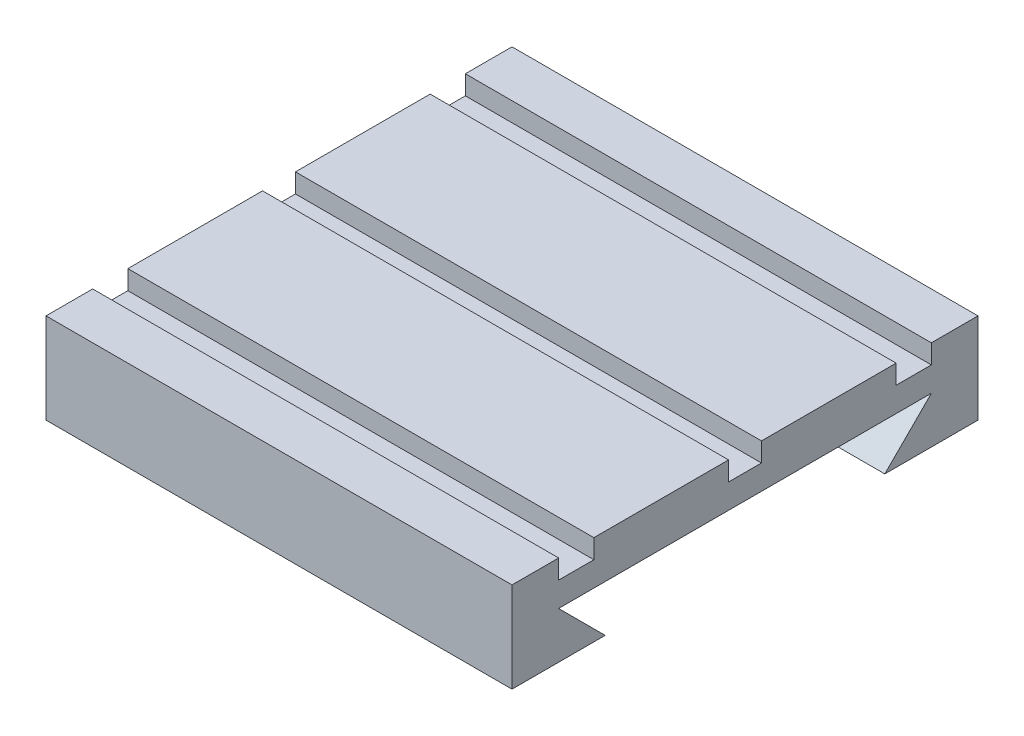
ISO-10303-21;
HEADER;
FILE_DESCRIPTION(('STEP AP214'),'2;1');
FILE_NAME('part.step','',(''),(''),'','','');
FILE_SCHEMA(('AUTOMOTIVE_DESIGN { 1 0 10303 214 1 1 1 1 }'));
ENDSEC;
DATA;
#1=APPLICATION_CONTEXT('core data for automotive mechanical design processes');
#2=APPLICATION_PROTOCOL_DEFINITION('international standard','automotive_design',2000,#1);
#3=PRODUCT_CONTEXT('',#1,'mechanical');
#4=PRODUCT('Part','Part','',(#3));
#5=PRODUCT_RELATED_PRODUCT_CATEGORY('part','',(#4));
#6=PRODUCT_DEFINITION_FORMATION('','',#4);
#7=PRODUCT_DEFINITION_CONTEXT('part definition',#1,'design');
#8=PRODUCT_DEFINITION('design','',#6,#7);
#9=PRODUCT_DEFINITION_SHAPE('','',#8);
#10=(LENGTH_UNIT() NAMED_UNIT(*) SI_UNIT(.MILLI.,.METRE.));
#11=(NAMED_UNIT(*) PLANE_ANGLE_UNIT() SI_UNIT($,.RADIAN.));
#12=(NAMED_UNIT(*) SI_UNIT($,.STERADIAN.) SOLID_ANGLE_UNIT());
#13=UNCERTAINTY_MEASURE_WITH_UNIT(LENGTH_MEASURE(1.E-05),#10,'distance_accuracy_value','');
#14=(GEOMETRIC_REPRESENTATION_CONTEXT(3) GLOBAL_UNCERTAINTY_ASSIGNED_CONTEXT((#13)) GLOBAL_UNIT_ASSIGNED_CONTEXT((#10,
#11,#12)) REPRESENTATION_CONTEXT('',''));
#15=CARTESIAN_POINT('',(0.,0.,0.));
#16=DIRECTION('',(0.,0.,1.));
#17=DIRECTION('',(1.,0.,0.));
#18=AXIS2_PLACEMENT_3D('',#15,#16,#17);
#19=CARTESIAN_POINT('',(100.,18.7709451023038,50.));
#20=DIRECTION('',(0.,-1.,0.));
#21=DIRECTION('',(0.,0.,-1.));
#22=AXIS2_PLACEMENT_3D('',#19,#20,#21);
#23=PLANE('',#22);
#24=DIRECTION('',(0.,0.,1.));
#25=VECTOR('',#24,1.);
#26=CARTESIAN_POINT('',(100.,18.7709451023038,50.));
#27=LINE('',#26,#25);
#28=CARTESIAN_POINT('',(100.,18.7709451023038,-3.53086493288125));
#29=VERTEX_POINT('',#28);
#30=CARTESIAN_POINT('',(100.,18.7709451023038,3.53086493288125));
#31=VERTEX_POINT('',#30);
#32=EDGE_CURVE('E56',#29,#31,#27,.T.);
#33=ORIENTED_EDGE('',*,*,#32,.F.);
#34=DIRECTION('',(1.,0.,0.));
#35=VECTOR('',#34,1.);
#36=CARTESIAN_POINT('',(0.,18.7709451023038,-3.53086493288125));
#37=LINE('',#36,#35);
#38=CARTESIAN_POINT('',(0.,18.7709451023038,-3.53086493288125));
#39=VERTEX_POINT('',#38);
#40=EDGE_CURVE('E228',#39,#29,#37,.T.);
#41=ORIENTED_EDGE('',*,*,#40,.F.);
#42=DIRECTION('',(0.,0.,1.));
#43=VECTOR('',#42,1.);
#44=CARTESIAN_POINT('',(0.,18.7709451023038,50.));
#45=LINE('',#44,#43);
#46=CARTESIAN_POINT('',(0.,18.7709451023038,3.53086493288125));
#47=VERTEX_POINT('',#46);
#48=EDGE_CURVE('E313',#39,#47,#45,.T.);
#49=ORIENTED_EDGE('',*,*,#48,.T.);
#50=DIRECTION('',(1.,0.,0.));
#51=VECTOR('',#50,1.);
#52=CARTESIAN_POINT('',(0.,18.7709451023038,3.53086493288125));
#53=LINE('',#52,#51);
#54=EDGE_CURVE('E259',#47,#31,#53,.T.);
#55=ORIENTED_EDGE('',*,*,#54,.T.);
#56=EDGE_LOOP('',(#33,#41,#49,#55));
#57=FACE_BOUND('',#56,.T.);
#58=ADVANCED_FACE('F33',(#57),#23,.F.);
#59=CARTESIAN_POINT('',(100.,18.7709451023038,32.4346894997231));
#60=VERTEX_POINT('',#59);
#61=CARTESIAN_POINT('',(100.,18.7709451023038,39.9890981933295));
#62=VERTEX_POINT('',#61);
#63=EDGE_CURVE('E299',#60,#62,#27,.T.);
#64=ORIENTED_EDGE('',*,*,#63,.F.);
#65=DIRECTION('',(1.,0.,0.));
#66=VECTOR('',#65,1.);
#67=CARTESIAN_POINT('',(0.,18.7709451023038,32.4346894997231));
#68=LINE('',#67,#66);
#69=CARTESIAN_POINT('',(0.,18.7709451023038,32.4346894997231));
#70=VERTEX_POINT('',#69);
#71=EDGE_CURVE('E246',#70,#60,#68,.T.);
#72=ORIENTED_EDGE('',*,*,#71,.F.);
#73=CARTESIAN_POINT('',(0.,18.7709451023038,39.9890981933295));
#74=VERTEX_POINT('',#73);
#75=EDGE_CURVE('E184',#70,#74,#45,.T.);
#76=ORIENTED_EDGE('',*,*,#75,.T.);
#77=DIRECTION('',(1.,0.,0.));
#78=VECTOR('',#77,1.);
#79=CARTESIAN_POINT('',(0.,18.7709451023038,39.9890981933295));
#80=LINE('',#79,#78);
#81=EDGE_CURVE('E270',#74,#62,#80,.T.);
#82=ORIENTED_EDGE('',*,*,#81,.T.);
#83=EDGE_LOOP('',(#64,#72,#76,#82));
#84=FACE_BOUND('',#83,.T.);
#85=ADVANCED_FACE('F358',(#84),#23,.F.);
#86=CARTESIAN_POINT('',(100.,3.49999999999999,50.));
#87=DIRECTION('',(0.,0.,-1.));
#88=DIRECTION('',(-1.,0.,0.));
#89=AXIS2_PLACEMENT_3D('',#86,#87,#88);
#90=PLANE('',#89);
#91=DIRECTION('',(0.,-1.,0.));
#92=VECTOR('',#91,1.);
#93=CARTESIAN_POINT('',(0.,3.49999999999999,50.));
#94=LINE('',#93,#92);
#95=CARTESIAN_POINT('',(0.,22.8776512814317,50.));
#96=VERTEX_POINT('',#95);
#97=CARTESIAN_POINT('',(0.,3.49999999999999,50.));
#98=VERTEX_POINT('',#97);
#99=EDGE_CURVE('E278',#96,#98,#94,.T.);
#100=ORIENTED_EDGE('',*,*,#99,.T.);
#101=DIRECTION('',(-1.,0.,0.));
#102=VECTOR('',#101,1.);
#103=CARTESIAN_POINT('',(100.,3.49999999999999,50.));
#104=LINE('',#103,#102);
#105=CARTESIAN_POINT('',(100.,3.49999999999999,50.));
#106=VERTEX_POINT('',#105);
#107=EDGE_CURVE('E11',#106,#98,#104,.T.);
#108=ORIENTED_EDGE('',*,*,#107,.F.);
#109=DIRECTION('',(0.,-1.,0.));
#110=VECTOR('',#109,1.);
#111=CARTESIAN_POINT('',(100.,3.49999999999999,50.));
#112=LINE('',#111,#110);
#113=CARTESIAN_POINT('',(100.,22.8776512814317,50.));
#114=VERTEX_POINT('',#113);
#115=EDGE_CURVE('E283',#114,#106,#112,.T.);
#116=ORIENTED_EDGE('',*,*,#115,.F.);
#117=DIRECTION('',(1.,0.,0.));
#118=VECTOR('',#117,1.);
#119=CARTESIAN_POINT('',(0.,22.8776512814317,50.));
#120=LINE('',#119,#118);
#121=EDGE_CURVE('E275',#96,#114,#120,.T.);
#122=ORIENTED_EDGE('',*,*,#121,.F.);
#123=EDGE_LOOP('',(#100,#108,#116,#122));
#124=FACE_BOUND('',#123,.T.);
#125=ADVANCED_FACE('F35',(#124),#90,.F.);
#126=CARTESIAN_POINT('',(100.,3.5,30.));
#127=DIRECTION('',(0.,1.,0.));
#128=DIRECTION('',(0.,0.,1.));
#129=AXIS2_PLACEMENT_3D('',#126,#127,#128);
#130=PLANE('',#129);
#131=DIRECTION('',(0.,0.,-1.));
#132=VECTOR('',#131,1.);
#133=CARTESIAN_POINT('',(0.,3.5,30.));
#134=LINE('',#133,#132);
#135=CARTESIAN_POINT('',(0.,3.5,30.));
#136=VERTEX_POINT('',#135);
#137=EDGE_CURVE('E303',#98,#136,#134,.T.);
#138=ORIENTED_EDGE('',*,*,#137,.T.);
#139=DIRECTION('',(-1.,0.,0.));
#140=VECTOR('',#139,1.);
#141=CARTESIAN_POINT('',(100.,3.5,30.));
#142=LINE('',#141,#140);
#143=CARTESIAN_POINT('',(100.,3.5,30.));
#144=VERTEX_POINT('',#143);
#145=EDGE_CURVE('E41',#144,#136,#142,.T.);
#146=ORIENTED_EDGE('',*,*,#145,.F.);
#147=DIRECTION('',(0.,0.,-1.));
#148=VECTOR('',#147,1.);
#149=CARTESIAN_POINT('',(100.,3.5,30.));
#150=LINE('',#149,#148);
#151=EDGE_CURVE('E286',#106,#144,#150,.T.);
#152=ORIENTED_EDGE('',*,*,#151,.F.);
#153=ORIENTED_EDGE('',*,*,#107,.T.);
#154=EDGE_LOOP('',(#138,#146,#152,#153));
#155=FACE_BOUND('',#154,.T.);
#156=ADVANCED_FACE('F345',(#155),#130,.F.);
#157=CARTESIAN_POINT('',(100.,3.5,30.));
#158=DIRECTION('',(0.,-0.707106781186552,0.707106781186544));
#159=DIRECTION('',(0.,-0.707106781186544,-0.707106781186551));
#160=AXIS2_PLACEMENT_3D('',#157,#158,#159);
#161=PLANE('',#160);
#162=DIRECTION('',(0.,0.707106781186544,0.707106781186551));
#163=VECTOR('',#162,1.);
#164=CARTESIAN_POINT('',(0.,3.5,30.));
#165=LINE('',#164,#163);
#166=CARTESIAN_POINT('',(0.,13.5,40.0000000000001));
#167=VERTEX_POINT('',#166);
#168=EDGE_CURVE('E305',#136,#167,#165,.T.);
#169=ORIENTED_EDGE('',*,*,#168,.T.);
#170=DIRECTION('',(-1.,0.,0.));
#171=VECTOR('',#170,1.);
#172=CARTESIAN_POINT('',(100.,13.5,40.0000000000001));
#173=LINE('',#172,#171);
#174=CARTESIAN_POINT('',(100.,13.5,40.0000000000001));
#175=VERTEX_POINT('',#174);
#176=EDGE_CURVE('E321',#175,#167,#173,.T.);
#177=ORIENTED_EDGE('',*,*,#176,.F.);
#178=DIRECTION('',(0.,0.707106781186544,0.707106781186551));
#179=VECTOR('',#178,1.);
#180=CARTESIAN_POINT('',(100.,3.5,30.));
#181=LINE('',#180,#179);
#182=EDGE_CURVE('E289',#144,#175,#181,.T.);
#183=ORIENTED_EDGE('',*,*,#182,.F.);
#184=ORIENTED_EDGE('',*,*,#145,.T.);
#185=EDGE_LOOP('',(#169,#177,#183,#184));
#186=FACE_BOUND('',#185,.T.);
#187=ADVANCED_FACE('F328',(#186),#161,.F.);
#188=CARTESIAN_POINT('',(100.,13.5,40.0000000000001));
#189=DIRECTION('',(0.,1.,0.));
#190=DIRECTION('',(0.,0.,1.));
#191=AXIS2_PLACEMENT_3D('',#188,#189,#190);
#192=PLANE('',#191);
#193=DIRECTION('',(0.,0.,-1.));
#194=VECTOR('',#193,1.);
#195=CARTESIAN_POINT('',(0.,13.5,40.0000000000001));
#196=LINE('',#195,#194);
#197=CARTESIAN_POINT('',(0.,13.5,-39.9999999999999));
#198=VERTEX_POINT('',#197);
#199=EDGE_CURVE('E307',#167,#198,#196,.T.);
#200=ORIENTED_EDGE('',*,*,#199,.T.);
#201=DIRECTION('',(-1.,0.,0.));
#202=VECTOR('',#201,1.);
#203=CARTESIAN_POINT('',(100.,13.5,-39.9999999999999));
#204=LINE('',#203,#202);
#205=CARTESIAN_POINT('',(100.,13.5,-39.9999999999999));
#206=VERTEX_POINT('',#205);
#207=EDGE_CURVE('E318',#206,#198,#204,.T.);
#208=ORIENTED_EDGE('',*,*,#207,.F.);
#209=DIRECTION('',(0.,0.,-1.));
#210=VECTOR('',#209,1.);
#211=CARTESIAN_POINT('',(100.,13.5,40.0000000000001));
#212=LINE('',#211,#210);
#213=EDGE_CURVE('E291',#175,#206,#212,.T.);
#214=ORIENTED_EDGE('',*,*,#213,.F.);
#215=ORIENTED_EDGE('',*,*,#176,.T.);
#216=EDGE_LOOP('',(#200,#208,#214,#215));
#217=FACE_BOUND('',#216,.T.);
#218=ADVANCED_FACE('F335',(#217),#192,.F.);
#219=CARTESIAN_POINT('',(100.,13.5,-39.9999999999999));
#220=DIRECTION('',(0.,-0.707106781186543,-0.707106781186552));
#221=DIRECTION('',(0.,0.707106781186552,-0.707106781186543));
#222=AXIS2_PLACEMENT_3D('',#219,#220,#221);
#223=PLANE('',#222);
#224=DIRECTION('',(0.,-0.707106781186552,0.707106781186543));
#225=VECTOR('',#224,1.);
#226=CARTESIAN_POINT('',(0.,13.5,-39.9999999999999));
#227=LINE('',#226,#225);
#228=CARTESIAN_POINT('',(0.,3.5,-30.));
#229=VERTEX_POINT('',#228);
#230=EDGE_CURVE('E309',#198,#229,#227,.T.);
#231=ORIENTED_EDGE('',*,*,#230,.T.);
#232=DIRECTION('',(-1.,0.,0.));
#233=VECTOR('',#232,1.);
#234=CARTESIAN_POINT('',(100.,3.5,-30.));
#235=LINE('',#234,#233);
#236=CARTESIAN_POINT('',(100.,3.5,-30.));
#237=VERTEX_POINT('',#236);
#238=EDGE_CURVE('E315',#237,#229,#235,.T.);
#239=ORIENTED_EDGE('',*,*,#238,.F.);
#240=DIRECTION('',(0.,-0.707106781186552,0.707106781186543));
#241=VECTOR('',#240,1.);
#242=CARTESIAN_POINT('',(100.,13.5,-39.9999999999999));
#243=LINE('',#242,#241);
#244=EDGE_CURVE('E293',#206,#237,#243,.T.);
#245=ORIENTED_EDGE('',*,*,#244,.F.);
#246=ORIENTED_EDGE('',*,*,#207,.T.);
#247=EDGE_LOOP('',(#231,#239,#245,#246));
#248=FACE_BOUND('',#247,.T.);
#249=ADVANCED_FACE('F339',(#248),#223,.F.);
#250=CARTESIAN_POINT('',(100.,3.50000000000001,-50.));
#251=DIRECTION('',(0.,1.,0.));
#252=DIRECTION('',(0.,0.,1.));
#253=AXIS2_PLACEMENT_3D('',#250,#251,#252);
#254=PLANE('',#253);
#255=DIRECTION('',(0.,0.,-1.));
#256=VECTOR('',#255,1.);
#257=CARTESIAN_POINT('',(0.,3.50000000000001,-50.));
#258=LINE('',#257,#256);
#259=CARTESIAN_POINT('',(0.,3.50000000000001,-50.));
#260=VERTEX_POINT('',#259);
#261=EDGE_CURVE('E185',#229,#260,#258,.T.);
#262=ORIENTED_EDGE('',*,*,#261,.T.);
#263=DIRECTION('',(-1.,0.,0.));
#264=VECTOR('',#263,1.);
#265=CARTESIAN_POINT('',(100.,3.50000000000001,-50.));
#266=LINE('',#265,#264);
#267=CARTESIAN_POINT('',(100.,3.50000000000001,-50.));
#268=VERTEX_POINT('',#267);
#269=EDGE_CURVE('E180',#268,#260,#266,.T.);
#270=ORIENTED_EDGE('',*,*,#269,.F.);
#271=DIRECTION('',(0.,0.,-1.));
#272=VECTOR('',#271,1.);
#273=CARTESIAN_POINT('',(100.,3.50000000000001,-50.));
#274=LINE('',#273,#272);
#275=EDGE_CURVE('E295',#237,#268,#274,.T.);
#276=ORIENTED_EDGE('',*,*,#275,.F.);
#277=ORIENTED_EDGE('',*,*,#238,.T.);
#278=EDGE_LOOP('',(#262,#270,#276,#277));
#279=FACE_BOUND('',#278,.T.);
#280=ADVANCED_FACE('F399',(#279),#254,.F.);
#281=CARTESIAN_POINT('',(100.,18.7709451023038,-50.));
#282=DIRECTION('',(0.,0.,1.));
#283=DIRECTION('',(1.,0.,0.));
#284=AXIS2_PLACEMENT_3D('',#281,#282,#283);
#285=PLANE('',#284);
#286=DIRECTION('',(0.,1.,0.));
#287=VECTOR('',#286,1.);
#288=CARTESIAN_POINT('',(0.,18.7709451023038,-50.));
#289=LINE('',#288,#287);
#290=CARTESIAN_POINT('',(0.,22.8776512814317,-50.));
#291=VERTEX_POINT('',#290);
#292=EDGE_CURVE('E173',#260,#291,#289,.T.);
#293=ORIENTED_EDGE('',*,*,#292,.T.);
#294=DIRECTION('',(1.,0.,0.));
#295=VECTOR('',#294,1.);
#296=CARTESIAN_POINT('',(0.,22.8776512814317,-50.));
#297=LINE('',#296,#295);
#298=CARTESIAN_POINT('',(100.,22.8776512814317,-50.));
#299=VERTEX_POINT('',#298);
#300=EDGE_CURVE('E177',#291,#299,#297,.T.);
#301=ORIENTED_EDGE('',*,*,#300,.T.);
#302=DIRECTION('',(0.,1.,0.));
#303=VECTOR('',#302,1.);
#304=CARTESIAN_POINT('',(100.,18.7709451023038,-50.));
#305=LINE('',#304,#303);
#306=EDGE_CURVE('E297',#268,#299,#305,.T.);
#307=ORIENTED_EDGE('',*,*,#306,.F.);
#308=ORIENTED_EDGE('',*,*,#269,.T.);
#309=EDGE_LOOP('',(#293,#301,#307,#308));
#310=FACE_BOUND('',#309,.T.);
#311=ADVANCED_FACE('F175',(#310),#285,.F.);
#312=CARTESIAN_POINT('',(100.,18.7709451023038,-39.9890981933295));
#313=VERTEX_POINT('',#312);
#314=CARTESIAN_POINT('',(100.,18.7709451023038,-32.4346894997231));
#315=VERTEX_POINT('',#314);
#316=EDGE_CURVE('E48',#313,#315,#27,.T.);
#317=ORIENTED_EDGE('',*,*,#316,.F.);
#318=DIRECTION('',(1.,0.,0.));
#319=VECTOR('',#318,1.);
#320=CARTESIAN_POINT('',(0.,18.7709451023038,-39.9890981933295));
#321=LINE('',#320,#319);
#322=CARTESIAN_POINT('',(0.,18.7709451023038,-39.9890981933295));
#323=VERTEX_POINT('',#322);
#324=EDGE_CURVE('E206',#323,#313,#321,.T.);
#325=ORIENTED_EDGE('',*,*,#324,.F.);
#326=CARTESIAN_POINT('',(0.,18.7709451023038,-32.4346894997231));
#327=VERTEX_POINT('',#326);
#328=EDGE_CURVE('E287',#323,#327,#45,.T.);
#329=ORIENTED_EDGE('',*,*,#328,.T.);
#330=DIRECTION('',(1.,0.,0.));
#331=VECTOR('',#330,1.);
#332=CARTESIAN_POINT('',(0.,18.7709451023038,-32.4346894997231));
#333=LINE('',#332,#331);
#334=EDGE_CURVE('E220',#327,#315,#333,.T.);
#335=ORIENTED_EDGE('',*,*,#334,.T.);
#336=EDGE_LOOP('',(#317,#325,#329,#335));
#337=FACE_BOUND('',#336,.T.);
#338=ADVANCED_FACE('F387',(#337),#23,.F.);
#339=CARTESIAN_POINT('',(100.,0.,0.));
#340=DIRECTION('',(-1.,0.,0.));
#341=DIRECTION('',(0.,0.,1.));
#342=AXIS2_PLACEMENT_3D('',#339,#340,#341);
#343=PLANE('',#342);
#344=ORIENTED_EDGE('',*,*,#115,.T.);
#345=ORIENTED_EDGE('',*,*,#151,.T.);
#346=ORIENTED_EDGE('',*,*,#182,.T.);
#347=ORIENTED_EDGE('',*,*,#213,.T.);
#348=ORIENTED_EDGE('',*,*,#244,.T.);
#349=ORIENTED_EDGE('',*,*,#275,.T.);
#350=ORIENTED_EDGE('',*,*,#306,.T.);
#351=DIRECTION('',(0.,0.,1.));
#352=VECTOR('',#351,1.);
#353=CARTESIAN_POINT('',(100.,22.8776512814317,-50.));
#354=LINE('',#353,#352);
#355=CARTESIAN_POINT('',(100.,22.8776512814317,-39.9890981933295));
#356=VERTEX_POINT('',#355);
#357=EDGE_CURVE('E193',#299,#356,#354,.T.);
#358=ORIENTED_EDGE('',*,*,#357,.T.);
#359=DIRECTION('',(0.,-1.,0.));
#360=VECTOR('',#359,1.);
#361=CARTESIAN_POINT('',(100.,18.7709451023038,-39.9890981933295));
#362=LINE('',#361,#360);
#363=EDGE_CURVE('E199',#356,#313,#362,.T.);
#364=ORIENTED_EDGE('',*,*,#363,.T.);
#365=ORIENTED_EDGE('',*,*,#316,.T.);
#366=DIRECTION('',(0.,1.,0.));
#367=VECTOR('',#366,1.);
#368=CARTESIAN_POINT('',(100.,18.7709451023038,-32.4346894997231));
#369=LINE('',#368,#367);
#370=CARTESIAN_POINT('',(100.,22.8776512814317,-32.4346894997231));
#371=VERTEX_POINT('',#370);
#372=EDGE_CURVE('E208',#315,#371,#369,.T.);
#373=ORIENTED_EDGE('',*,*,#372,.T.);
#374=DIRECTION('',(0.,0.,1.));
#375=VECTOR('',#374,1.);
#376=CARTESIAN_POINT('',(100.,22.8776512814317,-32.4346894997231));
#377=LINE('',#376,#375);
#378=CARTESIAN_POINT('',(100.,22.8776512814317,-3.53086493288125));
#379=VERTEX_POINT('',#378);
#380=EDGE_CURVE('E223',#371,#379,#377,.T.);
#381=ORIENTED_EDGE('',*,*,#380,.T.);
#382=DIRECTION('',(0.,-1.,0.));
#383=VECTOR('',#382,1.);
#384=CARTESIAN_POINT('',(100.,18.7709451023038,-3.53086493288125));
#385=LINE('',#384,#383);
#386=EDGE_CURVE('E214',#379,#29,#385,.T.);
#387=ORIENTED_EDGE('',*,*,#386,.T.);
#388=ORIENTED_EDGE('',*,*,#32,.T.);
#389=DIRECTION('',(0.,1.,0.));
#390=VECTOR('',#389,1.);
#391=CARTESIAN_POINT('',(100.,18.7709451023038,3.53086493288125));
#392=LINE('',#391,#390);
#393=CARTESIAN_POINT('',(100.,22.8776512814317,3.53086493288125));
#394=VERTEX_POINT('',#393);
#395=EDGE_CURVE('E249',#31,#394,#392,.T.);
#396=ORIENTED_EDGE('',*,*,#395,.T.);
#397=DIRECTION('',(0.,0.,1.));
#398=VECTOR('',#397,1.);
#399=CARTESIAN_POINT('',(100.,22.8776512814317,32.4346894997231));
#400=LINE('',#399,#398);
#401=CARTESIAN_POINT('',(100.,22.8776512814317,32.4346894997231));
#402=VERTEX_POINT('',#401);
#403=EDGE_CURVE('E240',#394,#402,#400,.T.);
#404=ORIENTED_EDGE('',*,*,#403,.T.);
#405=DIRECTION('',(0.,-1.,0.));
#406=VECTOR('',#405,1.);
#407=CARTESIAN_POINT('',(100.,18.7709451023038,32.4346894997231));
#408=LINE('',#407,#406);
#409=EDGE_CURVE('E230',#402,#60,#408,.T.);
#410=ORIENTED_EDGE('',*,*,#409,.T.);
#411=ORIENTED_EDGE('',*,*,#63,.T.);
#412=DIRECTION('',(0.,1.,0.));
#413=VECTOR('',#412,1.);
#414=CARTESIAN_POINT('',(100.,18.7709451023038,39.9890981933295));
#415=LINE('',#414,#413);
#416=CARTESIAN_POINT('',(100.,22.8776512814317,39.9890981933295));
#417=VERTEX_POINT('',#416);
#418=EDGE_CURVE('E256',#62,#417,#415,.T.);
#419=ORIENTED_EDGE('',*,*,#418,.T.);
#420=DIRECTION('',(0.,0.,1.));
#421=VECTOR('',#420,1.);
#422=CARTESIAN_POINT('',(100.,22.8776512814317,50.));
#423=LINE('',#422,#421);
#424=EDGE_CURVE('E267',#417,#114,#423,.T.);
#425=ORIENTED_EDGE('',*,*,#424,.T.);
#426=EDGE_LOOP('',(#344,#345,#346,#347,#348,#349,#350,#358,#364,#365,#373,#381,#387,#388,#396,
#404,#410,#411,#419,#425));
#427=FACE_BOUND('',#426,.T.);
#428=ADVANCED_FACE('F343',(#427),#343,.F.);
#429=CARTESIAN_POINT('',(0.,0.,0.));
#430=DIRECTION('',(-1.,0.,0.));
#431=DIRECTION('',(0.,0.,1.));
#432=AXIS2_PLACEMENT_3D('',#429,#430,#431);
#433=PLANE('',#432);
#434=ORIENTED_EDGE('',*,*,#99,.F.);
#435=DIRECTION('',(0.,0.,1.));
#436=VECTOR('',#435,1.);
#437=CARTESIAN_POINT('',(0.,22.8776512814317,50.));
#438=LINE('',#437,#436);
#439=CARTESIAN_POINT('',(0.,22.8776512814317,39.9890981933295));
#440=VERTEX_POINT('',#439);
#441=EDGE_CURVE('E266',#440,#96,#438,.T.);
#442=ORIENTED_EDGE('',*,*,#441,.F.);
#443=DIRECTION('',(0.,1.,0.));
#444=VECTOR('',#443,1.);
#445=CARTESIAN_POINT('',(0.,18.7709451023038,39.9890981933295));
#446=LINE('',#445,#444);
#447=EDGE_CURVE('E263',#74,#440,#446,.T.);
#448=ORIENTED_EDGE('',*,*,#447,.F.);
#449=ORIENTED_EDGE('',*,*,#75,.F.);
#450=DIRECTION('',(0.,-1.,0.));
#451=VECTOR('',#450,1.);
#452=CARTESIAN_POINT('',(0.,18.7709451023038,32.4346894997231));
#453=LINE('',#452,#451);
#454=CARTESIAN_POINT('',(0.,22.8776512814317,32.4346894997231));
#455=VERTEX_POINT('',#454);
#456=EDGE_CURVE('E236',#455,#70,#453,.T.);
#457=ORIENTED_EDGE('',*,*,#456,.F.);
#458=DIRECTION('',(0.,0.,1.));
#459=VECTOR('',#458,1.);
#460=CARTESIAN_POINT('',(0.,22.8776512814317,32.4346894997231));
#461=LINE('',#460,#459);
#462=CARTESIAN_POINT('',(0.,22.8776512814317,3.53086493288125));
#463=VERTEX_POINT('',#462);
#464=EDGE_CURVE('E243',#463,#455,#461,.T.);
#465=ORIENTED_EDGE('',*,*,#464,.F.);
#466=DIRECTION('',(0.,1.,0.));
#467=VECTOR('',#466,1.);
#468=CARTESIAN_POINT('',(0.,18.7709451023038,3.53086493288125));
#469=LINE('',#468,#467);
#470=EDGE_CURVE('E239',#47,#463,#469,.T.);
#471=ORIENTED_EDGE('',*,*,#470,.F.);
#472=ORIENTED_EDGE('',*,*,#48,.F.);
#473=DIRECTION('',(0.,-1.,0.));
#474=VECTOR('',#473,1.);
#475=CARTESIAN_POINT('',(0.,18.7709451023038,-3.53086493288125));
#476=LINE('',#475,#474);
#477=CARTESIAN_POINT('',(0.,22.8776512814317,-3.53086493288125));
#478=VERTEX_POINT('',#477);
#479=EDGE_CURVE('E217',#478,#39,#476,.T.);
#480=ORIENTED_EDGE('',*,*,#479,.F.);
#481=DIRECTION('',(0.,0.,1.));
#482=VECTOR('',#481,1.);
#483=CARTESIAN_POINT('',(0.,22.8776512814317,-32.4346894997231));
#484=LINE('',#483,#482);
#485=CARTESIAN_POINT('',(0.,22.8776512814317,-32.4346894997231));
#486=VERTEX_POINT('',#485);
#487=EDGE_CURVE('E213',#486,#478,#484,.T.);
#488=ORIENTED_EDGE('',*,*,#487,.F.);
#489=DIRECTION('',(0.,1.,0.));
#490=VECTOR('',#489,1.);
#491=CARTESIAN_POINT('',(0.,18.7709451023038,-32.4346894997231));
#492=LINE('',#491,#490);
#493=EDGE_CURVE('E210',#327,#486,#492,.T.);
#494=ORIENTED_EDGE('',*,*,#493,.F.);
#495=ORIENTED_EDGE('',*,*,#328,.F.);
#496=DIRECTION('',(0.,-1.,0.));
#497=VECTOR('',#496,1.);
#498=CARTESIAN_POINT('',(0.,18.7709451023038,-39.9890981933295));
#499=LINE('',#498,#497);
#500=CARTESIAN_POINT('',(0.,22.8776512814317,-39.9890981933295));
#501=VERTEX_POINT('',#500);
#502=EDGE_CURVE('E195',#501,#323,#499,.T.);
#503=ORIENTED_EDGE('',*,*,#502,.F.);
#504=DIRECTION('',(0.,0.,1.));
#505=VECTOR('',#504,1.);
#506=CARTESIAN_POINT('',(0.,22.8776512814317,-50.));
#507=LINE('',#506,#505);
#508=EDGE_CURVE('E190',#291,#501,#507,.T.);
#509=ORIENTED_EDGE('',*,*,#508,.F.);
#510=ORIENTED_EDGE('',*,*,#292,.F.);
#511=ORIENTED_EDGE('',*,*,#261,.F.);
#512=ORIENTED_EDGE('',*,*,#230,.F.);
#513=ORIENTED_EDGE('',*,*,#199,.F.);
#514=ORIENTED_EDGE('',*,*,#168,.F.);
#515=ORIENTED_EDGE('',*,*,#137,.F.);
#516=EDGE_LOOP('',(#434,#442,#448,#449,#457,#465,#471,#472,#480,#488,#494,#495,#503,#509,#510,
#511,#512,#513,#514,#515));
#517=FACE_BOUND('',#516,.T.);
#518=ADVANCED_FACE('F197',(#517),#433,.T.);
#519=CARTESIAN_POINT('',(0.,22.8776512814317,50.));
#520=DIRECTION('',(0.,1.,0.));
#521=DIRECTION('',(0.,0.,1.));
#522=AXIS2_PLACEMENT_3D('',#519,#520,#521);
#523=PLANE('',#522);
#524=ORIENTED_EDGE('',*,*,#424,.F.);
#525=DIRECTION('',(1.,0.,0.));
#526=VECTOR('',#525,1.);
#527=CARTESIAN_POINT('',(0.,22.8776512814317,39.9890981933295));
#528=LINE('',#527,#526);
#529=EDGE_CURVE('E279',#440,#417,#528,.T.);
#530=ORIENTED_EDGE('',*,*,#529,.F.);
#531=ORIENTED_EDGE('',*,*,#441,.T.);
#532=ORIENTED_EDGE('',*,*,#121,.T.);
#533=EDGE_LOOP('',(#524,#530,#531,#532));
#534=FACE_BOUND('',#533,.T.);
#535=ADVANCED_FACE('F352',(#534),#523,.T.);
#536=CARTESIAN_POINT('',(0.,18.7709451023038,39.9890981933295));
#537=DIRECTION('',(0.,0.,-1.));
#538=DIRECTION('',(-1.,0.,0.));
#539=AXIS2_PLACEMENT_3D('',#536,#537,#538);
#540=PLANE('',#539);
#541=ORIENTED_EDGE('',*,*,#418,.F.);
#542=ORIENTED_EDGE('',*,*,#81,.F.);
#543=ORIENTED_EDGE('',*,*,#447,.T.);
#544=ORIENTED_EDGE('',*,*,#529,.T.);
#545=EDGE_LOOP('',(#541,#542,#543,#544));
#546=FACE_BOUND('',#545,.T.);
#547=ADVANCED_FACE('F356',(#546),#540,.T.);
#548=CARTESIAN_POINT('',(0.,18.7709451023038,32.4346894997231));
#549=DIRECTION('',(0.,0.,1.));
#550=DIRECTION('',(1.,0.,0.));
#551=AXIS2_PLACEMENT_3D('',#548,#549,#550);
#552=PLANE('',#551);
#553=ORIENTED_EDGE('',*,*,#409,.F.);
#554=DIRECTION('',(1.,0.,0.));
#555=VECTOR('',#554,1.);
#556=CARTESIAN_POINT('',(0.,22.8776512814317,32.4346894997231));
#557=LINE('',#556,#555);
#558=EDGE_CURVE('E254',#455,#402,#557,.T.);
#559=ORIENTED_EDGE('',*,*,#558,.F.);
#560=ORIENTED_EDGE('',*,*,#456,.T.);
#561=ORIENTED_EDGE('',*,*,#71,.T.);
#562=EDGE_LOOP('',(#553,#559,#560,#561));
#563=FACE_BOUND('',#562,.T.);
#564=ADVANCED_FACE('F374',(#563),#552,.T.);
#565=CARTESIAN_POINT('',(0.,22.8776512814317,32.4346894997231));
#566=DIRECTION('',(0.,1.,0.));
#567=DIRECTION('',(0.,0.,1.));
#568=AXIS2_PLACEMENT_3D('',#565,#566,#567);
#569=PLANE('',#568);
#570=ORIENTED_EDGE('',*,*,#403,.F.);
#571=DIRECTION('',(1.,0.,0.));
#572=VECTOR('',#571,1.);
#573=CARTESIAN_POINT('',(0.,22.8776512814317,3.53086493288125));
#574=LINE('',#573,#572);
#575=EDGE_CURVE('E257',#463,#394,#574,.T.);
#576=ORIENTED_EDGE('',*,*,#575,.F.);
#577=ORIENTED_EDGE('',*,*,#464,.T.);
#578=ORIENTED_EDGE('',*,*,#558,.T.);
#579=EDGE_LOOP('',(#570,#576,#577,#578));
#580=FACE_BOUND('',#579,.T.);
#581=ADVANCED_FACE('F370',(#580),#569,.T.);
#582=CARTESIAN_POINT('',(0.,18.7709451023038,3.53086493288125));
#583=DIRECTION('',(0.,0.,-1.));
#584=DIRECTION('',(-1.,0.,0.));
#585=AXIS2_PLACEMENT_3D('',#582,#583,#584);
#586=PLANE('',#585);
#587=ORIENTED_EDGE('',*,*,#395,.F.);
#588=ORIENTED_EDGE('',*,*,#54,.F.);
#589=ORIENTED_EDGE('',*,*,#470,.T.);
#590=ORIENTED_EDGE('',*,*,#575,.T.);
#591=EDGE_LOOP('',(#587,#588,#589,#590));
#592=FACE_BOUND('',#591,.T.);
#593=ADVANCED_FACE('F366',(#592),#586,.T.);
#594=CARTESIAN_POINT('',(0.,18.7709451023038,-3.53086493288125));
#595=DIRECTION('',(0.,0.,1.));
#596=DIRECTION('',(1.,0.,0.));
#597=AXIS2_PLACEMENT_3D('',#594,#595,#596);
#598=PLANE('',#597);
#599=ORIENTED_EDGE('',*,*,#386,.F.);
#600=DIRECTION('',(1.,0.,0.));
#601=VECTOR('',#600,1.);
#602=CARTESIAN_POINT('',(0.,22.8776512814317,-3.53086493288125));
#603=LINE('',#602,#601);
#604=EDGE_CURVE('E231',#478,#379,#603,.T.);
#605=ORIENTED_EDGE('',*,*,#604,.F.);
#606=ORIENTED_EDGE('',*,*,#479,.T.);
#607=ORIENTED_EDGE('',*,*,#40,.T.);
#608=EDGE_LOOP('',(#599,#605,#606,#607));
#609=FACE_BOUND('',#608,.T.);
#610=ADVANCED_FACE('F531',(#609),#598,.T.);
#611=CARTESIAN_POINT('',(0.,22.8776512814317,-32.4346894997231));
#612=DIRECTION('',(0.,1.,0.));
#613=DIRECTION('',(0.,0.,1.));
#614=AXIS2_PLACEMENT_3D('',#611,#612,#613);
#615=PLANE('',#614);
#616=ORIENTED_EDGE('',*,*,#380,.F.);
#617=DIRECTION('',(1.,0.,0.));
#618=VECTOR('',#617,1.);
#619=CARTESIAN_POINT('',(0.,22.8776512814317,-32.4346894997231));
#620=LINE('',#619,#618);
#621=EDGE_CURVE('E233',#486,#371,#620,.T.);
#622=ORIENTED_EDGE('',*,*,#621,.F.);
#623=ORIENTED_EDGE('',*,*,#487,.T.);
#624=ORIENTED_EDGE('',*,*,#604,.T.);
#625=EDGE_LOOP('',(#616,#622,#623,#624));
#626=FACE_BOUND('',#625,.T.);
#627=ADVANCED_FACE('F538',(#626),#615,.T.);
#628=CARTESIAN_POINT('',(0.,18.7709451023038,-32.4346894997231));
#629=DIRECTION('',(0.,0.,-1.));
#630=DIRECTION('',(-1.,0.,0.));
#631=AXIS2_PLACEMENT_3D('',#628,#629,#630);
#632=PLANE('',#631);
#633=ORIENTED_EDGE('',*,*,#372,.F.);
#634=ORIENTED_EDGE('',*,*,#334,.F.);
#635=ORIENTED_EDGE('',*,*,#493,.T.);
#636=ORIENTED_EDGE('',*,*,#621,.T.);
#637=EDGE_LOOP('',(#633,#634,#635,#636));
#638=FACE_BOUND('',#637,.T.);
#639=ADVANCED_FACE('F547',(#638),#632,.T.);
#640=CARTESIAN_POINT('',(0.,18.7709451023038,-39.9890981933295));
#641=DIRECTION('',(0.,0.,1.));
#642=DIRECTION('',(1.,0.,0.));
#643=AXIS2_PLACEMENT_3D('',#640,#641,#642);
#644=PLANE('',#643);
#645=ORIENTED_EDGE('',*,*,#363,.F.);
#646=DIRECTION('',(1.,0.,0.));
#647=VECTOR('',#646,1.);
#648=CARTESIAN_POINT('',(0.,22.8776512814317,-39.9890981933295));
#649=LINE('',#648,#647);
#650=EDGE_CURVE('E194',#501,#356,#649,.T.);
#651=ORIENTED_EDGE('',*,*,#650,.F.);
#652=ORIENTED_EDGE('',*,*,#502,.T.);
#653=ORIENTED_EDGE('',*,*,#324,.T.);
#654=EDGE_LOOP('',(#645,#651,#652,#653));
#655=FACE_BOUND('',#654,.T.);
#656=ADVANCED_FACE('F556',(#655),#644,.T.);
#657=CARTESIAN_POINT('',(0.,22.8776512814317,-50.));
#658=DIRECTION('',(0.,1.,0.));
#659=DIRECTION('',(0.,0.,1.));
#660=AXIS2_PLACEMENT_3D('',#657,#658,#659);
#661=PLANE('',#660);
#662=ORIENTED_EDGE('',*,*,#357,.F.);
#663=ORIENTED_EDGE('',*,*,#300,.F.);
#664=ORIENTED_EDGE('',*,*,#508,.T.);
#665=ORIENTED_EDGE('',*,*,#650,.T.);
#666=EDGE_LOOP('',(#662,#663,#664,#665));
#667=FACE_BOUND('',#666,.T.);
#668=ADVANCED_FACE('F189',(#667),#661,.T.);
#669=CLOSED_SHELL('',(#58,#85,#125,#156,#187,#218,#249,#280,#311,#338,#428,#518,#535,#547,#564,
#581,#593,#610,#627,#639,#656,#668));
#670=MANIFOLD_SOLID_BREP('B2',#669);
#671=ADVANCED_BREP_SHAPE_REPRESENTATION('',(#18,#670),#14);
#672=SHAPE_DEFINITION_REPRESENTATION(#9,#671);
ENDSEC;
END-ISO-10303-21;
